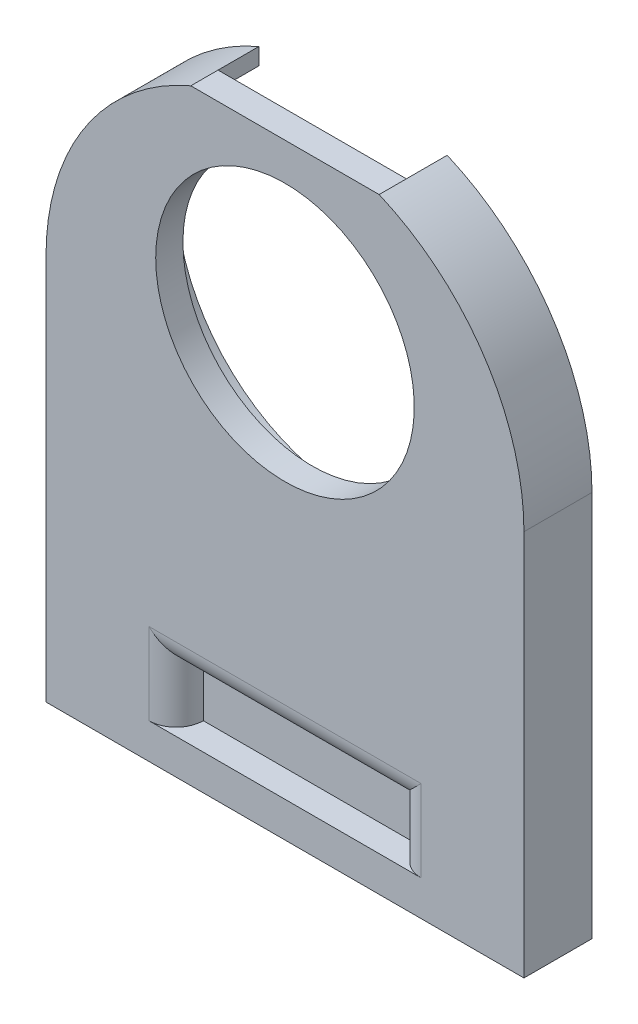
ISO-10303-21;
HEADER;
FILE_DESCRIPTION(('STEP AP214'),'2;1');
FILE_NAME('part.step','',(''),(''),'','','');
FILE_SCHEMA(('AUTOMOTIVE_DESIGN { 1 0 10303 214 1 1 1 1 }'));
ENDSEC;
DATA;
#1=APPLICATION_CONTEXT('core data for automotive mechanical design processes');
#2=APPLICATION_PROTOCOL_DEFINITION('international standard','automotive_design',2000,#1);
#3=PRODUCT_CONTEXT('',#1,'mechanical');
#4=PRODUCT('Part','Part','',(#3));
#5=PRODUCT_RELATED_PRODUCT_CATEGORY('part','',(#4));
#6=PRODUCT_DEFINITION_FORMATION('','',#4);
#7=PRODUCT_DEFINITION_CONTEXT('part definition',#1,'design');
#8=PRODUCT_DEFINITION('design','',#6,#7);
#9=PRODUCT_DEFINITION_SHAPE('','',#8);
#10=(LENGTH_UNIT() NAMED_UNIT(*) SI_UNIT(.MILLI.,.METRE.));
#11=(NAMED_UNIT(*) PLANE_ANGLE_UNIT() SI_UNIT($,.RADIAN.));
#12=(NAMED_UNIT(*) SI_UNIT($,.STERADIAN.) SOLID_ANGLE_UNIT());
#13=UNCERTAINTY_MEASURE_WITH_UNIT(LENGTH_MEASURE(1.E-05),#10,'distance_accuracy_value','');
#14=(GEOMETRIC_REPRESENTATION_CONTEXT(3) GLOBAL_UNCERTAINTY_ASSIGNED_CONTEXT((#13)) GLOBAL_UNIT_ASSIGNED_CONTEXT((#10,
#11,#12)) REPRESENTATION_CONTEXT('',''));
#15=CARTESIAN_POINT('',(0.,0.,0.));
#16=DIRECTION('',(0.,0.,1.));
#17=DIRECTION('',(1.,0.,0.));
#18=AXIS2_PLACEMENT_3D('',#15,#16,#17);
#19=CARTESIAN_POINT('',(8.78,8.5,1.5));
#20=DIRECTION('',(0.,0.,-1.));
#21=DIRECTION('',(-1.,0.,0.));
#22=AXIS2_PLACEMENT_3D('',#19,#20,#21);
#23=CYLINDRICAL_SURFACE('',#22,6.5);
#24=CARTESIAN_POINT('',(8.78,8.5,0.));
#25=DIRECTION('',(0.,0.,1.));
#26=DIRECTION('',(1.,0.,0.));
#27=AXIS2_PLACEMENT_3D('',#24,#25,#26);
#28=CIRCLE('',#27,6.5);
#29=CARTESIAN_POINT('',(5.32,14.0025812124856,0.));
#30=VERTEX_POINT('',#29);
#31=CARTESIAN_POINT('',(12.24,14.0025812124856,0.));
#32=VERTEX_POINT('',#31);
#33=EDGE_CURVE('E194',#30,#32,#28,.T.);
#34=ORIENTED_EDGE('',*,*,#33,.F.);
#35=DIRECTION('',(0.,0.,-1.));
#36=VECTOR('',#35,1.);
#37=CARTESIAN_POINT('',(5.32,14.0025812124856,1.5));
#38=LINE('',#37,#36);
#39=CARTESIAN_POINT('',(5.32,14.0025812124856,1.5));
#40=VERTEX_POINT('',#39);
#41=EDGE_CURVE('E233',#40,#30,#38,.T.);
#42=ORIENTED_EDGE('',*,*,#41,.F.);
#43=CARTESIAN_POINT('',(8.78,8.5,1.5));
#44=DIRECTION('',(0.,0.,1.));
#45=DIRECTION('',(1.,0.,0.));
#46=AXIS2_PLACEMENT_3D('',#43,#44,#45);
#47=CIRCLE('',#46,6.5);
#48=CARTESIAN_POINT('',(12.24,14.0025812124856,1.5));
#49=VERTEX_POINT('',#48);
#50=EDGE_CURVE('E195',#40,#49,#47,.T.);
#51=ORIENTED_EDGE('',*,*,#50,.T.);
#52=DIRECTION('',(0.,0.,-1.));
#53=VECTOR('',#52,1.);
#54=CARTESIAN_POINT('',(12.24,14.0025812124856,1.5));
#55=LINE('',#54,#53);
#56=EDGE_CURVE('E204',#49,#32,#55,.T.);
#57=ORIENTED_EDGE('',*,*,#56,.T.);
#58=EDGE_LOOP('',(#34,#42,#51,#57));
#59=FACE_BOUND('',#58,.T.);
#60=ADVANCED_FACE('F35',(#59),#23,.F.);
#61=CARTESIAN_POINT('',(5.32,0.,1.5));
#62=DIRECTION('',(-1.,0.,0.));
#63=DIRECTION('',(0.,0.,1.));
#64=AXIS2_PLACEMENT_3D('',#61,#62,#63);
#65=PLANE('',#64);
#66=DIRECTION('',(0.,1.,0.));
#67=VECTOR('',#66,1.);
#68=CARTESIAN_POINT('',(5.32,0.,0.));
#69=LINE('',#68,#67);
#70=CARTESIAN_POINT('',(5.32,14.6194981256581,0.));
#71=VERTEX_POINT('',#70);
#72=EDGE_CURVE('E207',#30,#71,#69,.T.);
#73=ORIENTED_EDGE('',*,*,#72,.T.);
#74=DIRECTION('',(0.,0.,-1.));
#75=VECTOR('',#74,1.);
#76=CARTESIAN_POINT('',(5.32,14.6194981256581,1.5));
#77=LINE('',#76,#75);
#78=CARTESIAN_POINT('',(5.32,14.6194981256581,1.5));
#79=VERTEX_POINT('',#78);
#80=EDGE_CURVE('E230',#79,#71,#77,.T.);
#81=ORIENTED_EDGE('',*,*,#80,.F.);
#82=DIRECTION('',(0.,1.,0.));
#83=VECTOR('',#82,1.);
#84=CARTESIAN_POINT('',(5.32,0.,1.5));
#85=LINE('',#84,#83);
#86=EDGE_CURVE('E198',#40,#79,#85,.T.);
#87=ORIENTED_EDGE('',*,*,#86,.F.);
#88=ORIENTED_EDGE('',*,*,#41,.T.);
#89=EDGE_LOOP('',(#73,#81,#87,#88));
#90=FACE_BOUND('',#89,.T.);
#91=ADVANCED_FACE('F256',(#90),#65,.F.);
#92=CARTESIAN_POINT('',(8.78,6.55,1.5));
#93=DIRECTION('',(0.,0.,-1.));
#94=DIRECTION('',(-1.,0.,0.));
#95=AXIS2_PLACEMENT_3D('',#92,#93,#94);
#96=CYLINDRICAL_SURFACE('',#95,8.78);
#97=CARTESIAN_POINT('',(8.78,6.55,0.));
#98=DIRECTION('',(0.,0.,1.));
#99=DIRECTION('',(1.,0.,0.));
#100=AXIS2_PLACEMENT_3D('',#97,#98,#99);
#101=CIRCLE('',#100,8.78);
#102=CARTESIAN_POINT('',(0.,6.55,0.));
#103=VERTEX_POINT('',#102);
#104=EDGE_CURVE('E209',#71,#103,#101,.T.);
#105=ORIENTED_EDGE('',*,*,#104,.T.);
#106=DIRECTION('',(0.,0.,-1.));
#107=VECTOR('',#106,1.);
#108=CARTESIAN_POINT('',(0.,6.55,1.5));
#109=LINE('',#108,#107);
#110=CARTESIAN_POINT('',(0.,6.55,2.5));
#111=VERTEX_POINT('',#110);
#112=EDGE_CURVE('E228',#111,#103,#109,.T.);
#113=ORIENTED_EDGE('',*,*,#112,.F.);
#114=CARTESIAN_POINT('',(8.78,6.55,2.5));
#115=DIRECTION('',(0.,0.,1.));
#116=DIRECTION('',(1.,0.,0.));
#117=AXIS2_PLACEMENT_3D('',#114,#115,#116);
#118=CIRCLE('',#117,8.78);
#119=CARTESIAN_POINT('',(5.32,14.6194981256581,2.5));
#120=VERTEX_POINT('',#119);
#121=EDGE_CURVE('E179',#120,#111,#118,.T.);
#122=ORIENTED_EDGE('',*,*,#121,.F.);
#123=DIRECTION('',(0.,0.,-1.));
#124=VECTOR('',#123,1.);
#125=CARTESIAN_POINT('',(5.32,14.6194981256581,2.5));
#126=LINE('',#125,#124);
#127=EDGE_CURVE('E187',#120,#79,#126,.T.);
#128=ORIENTED_EDGE('',*,*,#127,.T.);
#129=ORIENTED_EDGE('',*,*,#80,.T.);
#130=EDGE_LOOP('',(#105,#113,#122,#128,#129));
#131=FACE_BOUND('',#130,.T.);
#132=ADVANCED_FACE('F262',(#131),#96,.T.);
#133=CARTESIAN_POINT('',(0.,0.,1.5));
#134=DIRECTION('',(-1.,0.,0.));
#135=DIRECTION('',(0.,0.,1.));
#136=AXIS2_PLACEMENT_3D('',#133,#134,#135);
#137=PLANE('',#136);
#138=DIRECTION('',(0.,1.,0.));
#139=VECTOR('',#138,1.);
#140=CARTESIAN_POINT('',(0.,0.,0.));
#141=LINE('',#140,#139);
#142=CARTESIAN_POINT('',(0.,-7.65,0.));
#143=VERTEX_POINT('',#142);
#144=EDGE_CURVE('E212',#143,#103,#141,.T.);
#145=ORIENTED_EDGE('',*,*,#144,.F.);
#146=DIRECTION('',(0.,0.,-1.));
#147=VECTOR('',#146,1.);
#148=CARTESIAN_POINT('',(0.,-7.65,2.5));
#149=LINE('',#148,#147);
#150=CARTESIAN_POINT('',(0.,-7.65,2.5));
#151=VERTEX_POINT('',#150);
#152=EDGE_CURVE('E158',#151,#143,#149,.T.);
#153=ORIENTED_EDGE('',*,*,#152,.F.);
#154=DIRECTION('',(0.,-1.,0.));
#155=VECTOR('',#154,1.);
#156=CARTESIAN_POINT('',(0.,0.,2.5));
#157=LINE('',#156,#155);
#158=EDGE_CURVE('E182',#111,#151,#157,.T.);
#159=ORIENTED_EDGE('',*,*,#158,.F.);
#160=ORIENTED_EDGE('',*,*,#112,.T.);
#161=EDGE_LOOP('',(#145,#153,#159,#160));
#162=FACE_BOUND('',#161,.T.);
#163=ADVANCED_FACE('F324',(#162),#137,.T.);
#164=CARTESIAN_POINT('',(17.56,0.,1.5));
#165=DIRECTION('',(-1.,0.,0.));
#166=DIRECTION('',(0.,0.,1.));
#167=AXIS2_PLACEMENT_3D('',#164,#165,#166);
#168=PLANE('',#167);
#169=DIRECTION('',(0.,1.,0.));
#170=VECTOR('',#169,1.);
#171=CARTESIAN_POINT('',(17.56,0.,0.));
#172=LINE('',#171,#170);
#173=CARTESIAN_POINT('',(17.56,-7.65,0.));
#174=VERTEX_POINT('',#173);
#175=CARTESIAN_POINT('',(17.56,6.55,0.));
#176=VERTEX_POINT('',#175);
#177=EDGE_CURVE('E215',#174,#176,#172,.T.);
#178=ORIENTED_EDGE('',*,*,#177,.T.);
#179=DIRECTION('',(0.,0.,-1.));
#180=VECTOR('',#179,1.);
#181=CARTESIAN_POINT('',(17.56,6.55,1.5));
#182=LINE('',#181,#180);
#183=CARTESIAN_POINT('',(17.56,6.55,2.5));
#184=VERTEX_POINT('',#183);
#185=EDGE_CURVE('E225',#184,#176,#182,.T.);
#186=ORIENTED_EDGE('',*,*,#185,.F.);
#187=DIRECTION('',(0.,1.,0.));
#188=VECTOR('',#187,1.);
#189=CARTESIAN_POINT('',(17.56,0.,2.5));
#190=LINE('',#189,#188);
#191=CARTESIAN_POINT('',(17.56,-7.65,2.5));
#192=VERTEX_POINT('',#191);
#193=EDGE_CURVE('E184',#192,#184,#190,.T.);
#194=ORIENTED_EDGE('',*,*,#193,.F.);
#195=DIRECTION('',(0.,0.,1.));
#196=VECTOR('',#195,1.);
#197=CARTESIAN_POINT('',(17.56,-7.65,0.));
#198=LINE('',#197,#196);
#199=EDGE_CURVE('E164',#174,#192,#198,.T.);
#200=ORIENTED_EDGE('',*,*,#199,.F.);
#201=EDGE_LOOP('',(#178,#186,#194,#200));
#202=FACE_BOUND('',#201,.T.);
#203=ADVANCED_FACE('F320',(#202),#168,.F.);
#204=CARTESIAN_POINT('',(8.78,6.55,1.5));
#205=DIRECTION('',(0.,0.,-1.));
#206=DIRECTION('',(-1.,0.,0.));
#207=AXIS2_PLACEMENT_3D('',#204,#205,#206);
#208=CYLINDRICAL_SURFACE('',#207,8.78);
#209=CARTESIAN_POINT('',(8.78,6.55,0.));
#210=DIRECTION('',(0.,0.,1.));
#211=DIRECTION('',(1.,0.,0.));
#212=AXIS2_PLACEMENT_3D('',#209,#210,#211);
#213=CIRCLE('',#212,8.78);
#214=CARTESIAN_POINT('',(12.24,14.6194981256581,0.));
#215=VERTEX_POINT('',#214);
#216=EDGE_CURVE('E217',#176,#215,#213,.T.);
#217=ORIENTED_EDGE('',*,*,#216,.T.);
#218=DIRECTION('',(0.,0.,-1.));
#219=VECTOR('',#218,1.);
#220=CARTESIAN_POINT('',(12.24,14.6194981256581,1.5));
#221=LINE('',#220,#219);
#222=CARTESIAN_POINT('',(12.24,14.6194981256581,1.5));
#223=VERTEX_POINT('',#222);
#224=EDGE_CURVE('E223',#223,#215,#221,.T.);
#225=ORIENTED_EDGE('',*,*,#224,.F.);
#226=DIRECTION('',(0.,0.,-1.));
#227=VECTOR('',#226,1.);
#228=CARTESIAN_POINT('',(12.24,14.6194981256581,2.5));
#229=LINE('',#228,#227);
#230=CARTESIAN_POINT('',(12.24,14.6194981256581,2.5));
#231=VERTEX_POINT('',#230);
#232=EDGE_CURVE('E191',#231,#223,#229,.T.);
#233=ORIENTED_EDGE('',*,*,#232,.F.);
#234=CARTESIAN_POINT('',(8.78,6.55,2.5));
#235=DIRECTION('',(0.,0.,1.));
#236=DIRECTION('',(1.,0.,0.));
#237=AXIS2_PLACEMENT_3D('',#234,#235,#236);
#238=CIRCLE('',#237,8.78);
#239=EDGE_CURVE('E174',#184,#231,#238,.T.);
#240=ORIENTED_EDGE('',*,*,#239,.F.);
#241=ORIENTED_EDGE('',*,*,#185,.T.);
#242=EDGE_LOOP('',(#217,#225,#233,#240,#241));
#243=FACE_BOUND('',#242,.T.);
#244=ADVANCED_FACE('F323',(#243),#208,.T.);
#245=CARTESIAN_POINT('',(12.24,0.,1.5));
#246=DIRECTION('',(-1.,0.,0.));
#247=DIRECTION('',(0.,0.,1.));
#248=AXIS2_PLACEMENT_3D('',#245,#246,#247);
#249=PLANE('',#248);
#250=DIRECTION('',(0.,1.,0.));
#251=VECTOR('',#250,1.);
#252=CARTESIAN_POINT('',(12.24,0.,0.));
#253=LINE('',#252,#251);
#254=EDGE_CURVE('E199',#32,#215,#253,.T.);
#255=ORIENTED_EDGE('',*,*,#254,.F.);
#256=ORIENTED_EDGE('',*,*,#56,.F.);
#257=DIRECTION('',(0.,1.,0.));
#258=VECTOR('',#257,1.);
#259=CARTESIAN_POINT('',(12.24,0.,1.5));
#260=LINE('',#259,#258);
#261=EDGE_CURVE('E201',#49,#223,#260,.T.);
#262=ORIENTED_EDGE('',*,*,#261,.T.);
#263=ORIENTED_EDGE('',*,*,#224,.T.);
#264=EDGE_LOOP('',(#255,#256,#262,#263));
#265=FACE_BOUND('',#264,.T.);
#266=ADVANCED_FACE('F311',(#265),#249,.T.);
#267=CARTESIAN_POINT('',(0.,0.,0.));
#268=DIRECTION('',(0.,0.,1.));
#269=DIRECTION('',(1.,0.,0.));
#270=AXIS2_PLACEMENT_3D('',#267,#268,#269);
#271=PLANE('',#270);
#272=ORIENTED_EDGE('',*,*,#33,.T.);
#273=ORIENTED_EDGE('',*,*,#254,.T.);
#274=ORIENTED_EDGE('',*,*,#216,.F.);
#275=ORIENTED_EDGE('',*,*,#177,.F.);
#276=DIRECTION('',(1.,0.,0.));
#277=VECTOR('',#276,1.);
#278=CARTESIAN_POINT('',(0.,-7.65,0.));
#279=LINE('',#278,#277);
#280=EDGE_CURVE('E161',#143,#174,#279,.T.);
#281=ORIENTED_EDGE('',*,*,#280,.F.);
#282=ORIENTED_EDGE('',*,*,#144,.T.);
#283=ORIENTED_EDGE('',*,*,#104,.F.);
#284=ORIENTED_EDGE('',*,*,#72,.F.);
#285=EDGE_LOOP('',(#272,#273,#274,#275,#281,#282,#283,#284));
#286=FACE_BOUND('',#285,.T.);
#287=ADVANCED_FACE('F307',(#286),#271,.F.);
#288=CARTESIAN_POINT('',(0.,0.,1.5));
#289=DIRECTION('',(0.,0.,1.));
#290=DIRECTION('',(1.,0.,0.));
#291=AXIS2_PLACEMENT_3D('',#288,#289,#290);
#292=PLANE('',#291);
#293=CARTESIAN_POINT('',(8.78,8.5,1.5));
#294=DIRECTION('',(0.,0.,-1.));
#295=DIRECTION('',(-1.,0.,0.));
#296=AXIS2_PLACEMENT_3D('',#293,#294,#295);
#297=CIRCLE('',#296,4.75);
#298=CARTESIAN_POINT('',(4.03,8.5,1.5));
#299=VERTEX_POINT('',#298);
#300=EDGE_CURVE('E167',#299,#299,#297,.T.);
#301=ORIENTED_EDGE('',*,*,#300,.F.);
#302=EDGE_LOOP('',(#301));
#303=FACE_BOUND('',#302,.T.);
#304=ORIENTED_EDGE('',*,*,#50,.F.);
#305=ORIENTED_EDGE('',*,*,#86,.T.);
#306=DIRECTION('',(1.,0.,0.));
#307=VECTOR('',#306,1.);
#308=CARTESIAN_POINT('',(0.,14.6194981256581,1.5));
#309=LINE('',#308,#307);
#310=EDGE_CURVE('E171',#79,#223,#309,.T.);
#311=ORIENTED_EDGE('',*,*,#310,.T.);
#312=ORIENTED_EDGE('',*,*,#261,.F.);
#313=EDGE_LOOP('',(#304,#305,#311,#312));
#314=FACE_BOUND('',#313,.T.);
#315=ADVANCED_FACE('F310',(#303,#314),#292,.F.);
#316=CARTESIAN_POINT('',(0.,14.6194981256581,2.5));
#317=DIRECTION('',(0.,1.,0.));
#318=DIRECTION('',(0.,0.,1.));
#319=AXIS2_PLACEMENT_3D('',#316,#317,#318);
#320=PLANE('',#319);
#321=ORIENTED_EDGE('',*,*,#310,.F.);
#322=ORIENTED_EDGE('',*,*,#127,.F.);
#323=DIRECTION('',(1.,0.,0.));
#324=VECTOR('',#323,1.);
#325=CARTESIAN_POINT('',(0.,14.6194981256581,2.5));
#326=LINE('',#325,#324);
#327=EDGE_CURVE('E176',#120,#231,#326,.T.);
#328=ORIENTED_EDGE('',*,*,#327,.T.);
#329=ORIENTED_EDGE('',*,*,#232,.T.);
#330=EDGE_LOOP('',(#321,#322,#328,#329));
#331=FACE_BOUND('',#330,.T.);
#332=ADVANCED_FACE('F294',(#331),#320,.T.);
#333=CARTESIAN_POINT('',(0.,0.,2.5));
#334=DIRECTION('',(0.,0.,1.));
#335=DIRECTION('',(1.,0.,0.));
#336=AXIS2_PLACEMENT_3D('',#333,#334,#335);
#337=PLANE('',#336);
#338=DIRECTION('',(0.,1.,0.));
#339=VECTOR('',#338,1.);
#340=CARTESIAN_POINT('',(13.78,-6.35316683145248,2.5));
#341=LINE('',#340,#339);
#342=CARTESIAN_POINT('',(13.78,-3.35316683145248,2.5));
#343=VERTEX_POINT('',#342);
#344=CARTESIAN_POINT('',(13.78,-6.35316683145248,2.5));
#345=VERTEX_POINT('',#344);
#346=EDGE_CURVE('E142',#343,#345,#341,.F.);
#347=ORIENTED_EDGE('',*,*,#346,.T.);
#348=DIRECTION('',(1.,0.,0.));
#349=VECTOR('',#348,1.);
#350=CARTESIAN_POINT('',(12.78,-6.35316683145248,2.5));
#351=LINE('',#350,#349);
#352=CARTESIAN_POINT('',(3.78,-6.35316683145248,2.5));
#353=VERTEX_POINT('',#352);
#354=EDGE_CURVE('E52',#353,#345,#351,.T.);
#355=ORIENTED_EDGE('',*,*,#354,.F.);
#356=DIRECTION('',(0.,-1.,0.));
#357=VECTOR('',#356,1.);
#358=CARTESIAN_POINT('',(3.78,-4.35316683145248,2.5));
#359=LINE('',#358,#357);
#360=CARTESIAN_POINT('',(3.78,-3.35316683145248,2.5));
#361=VERTEX_POINT('',#360);
#362=EDGE_CURVE('E238',#353,#361,#359,.F.);
#363=ORIENTED_EDGE('',*,*,#362,.T.);
#364=DIRECTION('',(-1.,0.,0.));
#365=VECTOR('',#364,1.);
#366=CARTESIAN_POINT('',(12.78,-3.35316683145248,2.5));
#367=LINE('',#366,#365);
#368=EDGE_CURVE('E235',#361,#343,#367,.F.);
#369=ORIENTED_EDGE('',*,*,#368,.T.);
#370=EDGE_LOOP('',(#347,#355,#363,#369));
#371=FACE_BOUND('',#370,.T.);
#372=CARTESIAN_POINT('',(8.78,8.5,2.5));
#373=DIRECTION('',(0.,0.,-1.));
#374=DIRECTION('',(-1.,0.,0.));
#375=AXIS2_PLACEMENT_3D('',#372,#373,#374);
#376=CIRCLE('',#375,4.75);
#377=CARTESIAN_POINT('',(4.03,8.5,2.5));
#378=VERTEX_POINT('',#377);
#379=EDGE_CURVE('E168',#378,#378,#376,.T.);
#380=ORIENTED_EDGE('',*,*,#379,.T.);
#381=EDGE_LOOP('',(#380));
#382=FACE_BOUND('',#381,.T.);
#383=ORIENTED_EDGE('',*,*,#239,.T.);
#384=ORIENTED_EDGE('',*,*,#327,.F.);
#385=ORIENTED_EDGE('',*,*,#121,.T.);
#386=ORIENTED_EDGE('',*,*,#158,.T.);
#387=DIRECTION('',(-1.,0.,0.));
#388=VECTOR('',#387,1.);
#389=CARTESIAN_POINT('',(17.56,-7.65,2.5));
#390=LINE('',#389,#388);
#391=EDGE_CURVE('E154',#192,#151,#390,.T.);
#392=ORIENTED_EDGE('',*,*,#391,.F.);
#393=ORIENTED_EDGE('',*,*,#193,.T.);
#394=EDGE_LOOP('',(#383,#384,#385,#386,#392,#393));
#395=FACE_BOUND('',#394,.T.);
#396=ADVANCED_FACE('F289',(#371,#382,#395),#337,.T.);
#397=CARTESIAN_POINT('',(8.78,8.5,2.5));
#398=DIRECTION('',(0.,0.,-1.));
#399=DIRECTION('',(-1.,0.,0.));
#400=AXIS2_PLACEMENT_3D('',#397,#398,#399);
#401=CYLINDRICAL_SURFACE('',#400,4.75);
#402=ORIENTED_EDGE('',*,*,#379,.F.);
#403=EDGE_LOOP('',(#402));
#404=FACE_BOUND('',#403,.T.);
#405=ORIENTED_EDGE('',*,*,#300,.T.);
#406=EDGE_LOOP('',(#405));
#407=FACE_BOUND('',#406,.T.);
#408=ADVANCED_FACE('F252',(#404,#407),#401,.F.);
#409=CARTESIAN_POINT('',(0.,-7.65,0.));
#410=DIRECTION('',(0.,-1.,0.));
#411=DIRECTION('',(0.,0.,-1.));
#412=AXIS2_PLACEMENT_3D('',#409,#410,#411);
#413=PLANE('',#412);
#414=ORIENTED_EDGE('',*,*,#391,.T.);
#415=ORIENTED_EDGE('',*,*,#152,.T.);
#416=ORIENTED_EDGE('',*,*,#280,.T.);
#417=ORIENTED_EDGE('',*,*,#199,.T.);
#418=EDGE_LOOP('',(#414,#415,#416,#417));
#419=FACE_BOUND('',#418,.T.);
#420=ADVANCED_FACE('F245',(#419),#413,.T.);
#421=CARTESIAN_POINT('',(12.78,-6.35316683145248,1.5));
#422=DIRECTION('',(0.,-1.,0.));
#423=DIRECTION('',(1.,0.,0.));
#424=AXIS2_PLACEMENT_3D('',#421,#422,#423);
#425=PLANE('',#424);
#426=ORIENTED_EDGE('',*,*,#354,.T.);
#427=CARTESIAN_POINT('',(13.78,-6.35316683145248,1.5));
#428=DIRECTION('',(0.,-1.,0.));
#429=DIRECTION('',(1.,0.,0.));
#430=AXIS2_PLACEMENT_3D('',#427,#428,#429);
#431=CIRCLE('',#430,1.);
#432=CARTESIAN_POINT('',(12.78,-6.35316683145248,1.5));
#433=VERTEX_POINT('',#432);
#434=EDGE_CURVE('E11',#345,#433,#431,.T.);
#435=ORIENTED_EDGE('',*,*,#434,.T.);
#436=DIRECTION('',(1.,0.,0.));
#437=VECTOR('',#436,1.);
#438=CARTESIAN_POINT('',(12.78,-6.35316683145248,1.5));
#439=LINE('',#438,#437);
#440=CARTESIAN_POINT('',(4.78,-6.35316683145248,1.5));
#441=VERTEX_POINT('',#440);
#442=EDGE_CURVE('E136',#441,#433,#439,.T.);
#443=ORIENTED_EDGE('',*,*,#442,.F.);
#444=CARTESIAN_POINT('',(3.78,-6.35316683145248,1.5));
#445=DIRECTION('',(0.,-1.,0.));
#446=DIRECTION('',(1.,0.,0.));
#447=AXIS2_PLACEMENT_3D('',#444,#445,#446);
#448=CIRCLE('',#447,1.);
#449=EDGE_CURVE('E44',#441,#353,#448,.T.);
#450=ORIENTED_EDGE('',*,*,#449,.T.);
#451=EDGE_LOOP('',(#426,#435,#443,#450));
#452=FACE_BOUND('',#451,.T.);
#453=ADVANCED_FACE('F243',(#452),#425,.F.);
#454=CARTESIAN_POINT('',(0.,0.,1.5));
#455=DIRECTION('',(0.,0.,1.));
#456=DIRECTION('',(1.,0.,0.));
#457=AXIS2_PLACEMENT_3D('',#454,#455,#456);
#458=PLANE('',#457);
#459=DIRECTION('',(0.,1.,0.));
#460=VECTOR('',#459,1.);
#461=CARTESIAN_POINT('',(12.78,-6.35316683145248,1.5));
#462=LINE('',#461,#460);
#463=CARTESIAN_POINT('',(12.78,-4.35316683145248,1.5));
#464=VERTEX_POINT('',#463);
#465=EDGE_CURVE('E128',#433,#464,#462,.T.);
#466=ORIENTED_EDGE('',*,*,#465,.T.);
#467=DIRECTION('',(-1.,0.,0.));
#468=VECTOR('',#467,1.);
#469=CARTESIAN_POINT('',(12.78,-4.35316683145248,1.5));
#470=LINE('',#469,#468);
#471=CARTESIAN_POINT('',(4.78,-4.35316683145248,1.5));
#472=VERTEX_POINT('',#471);
#473=EDGE_CURVE('E133',#464,#472,#470,.T.);
#474=ORIENTED_EDGE('',*,*,#473,.T.);
#475=DIRECTION('',(0.,-1.,0.));
#476=VECTOR('',#475,1.);
#477=CARTESIAN_POINT('',(4.78,-6.35316683145248,1.5));
#478=LINE('',#477,#476);
#479=EDGE_CURVE('E149',#472,#441,#478,.T.);
#480=ORIENTED_EDGE('',*,*,#479,.T.);
#481=ORIENTED_EDGE('',*,*,#442,.T.);
#482=EDGE_LOOP('',(#466,#474,#480,#481));
#483=FACE_BOUND('',#482,.T.);
#484=ADVANCED_FACE('F130',(#483),#458,.T.);
#485=CARTESIAN_POINT('',(13.78,-6.35316683145248,1.5));
#486=DIRECTION('',(0.,-1.,0.));
#487=DIRECTION('',(0.,0.,-1.));
#488=AXIS2_PLACEMENT_3D('',#485,#486,#487);
#489=CYLINDRICAL_SURFACE('',#488,1.);
#490=ORIENTED_EDGE('',*,*,#434,.F.);
#491=ORIENTED_EDGE('',*,*,#346,.F.);
#492=CARTESIAN_POINT('',(13.78,-3.35316683145248,1.5));
#493=DIRECTION('',(0.707106781186547,-0.707106781186547,0.));
#494=DIRECTION('',(-0.707106781186547,-0.707106781186547,0.));
#495=AXIS2_PLACEMENT_3D('',#492,#493,#494);
#496=ELLIPSE('',#495,1.41421356237309,1.);
#497=EDGE_CURVE('E39',#464,#343,#496,.F.);
#498=ORIENTED_EDGE('',*,*,#497,.F.);
#499=ORIENTED_EDGE('',*,*,#465,.F.);
#500=EDGE_LOOP('',(#490,#491,#498,#499));
#501=FACE_BOUND('',#500,.T.);
#502=ADVANCED_FACE('F37',(#501),#489,.T.);
#503=CARTESIAN_POINT('',(12.78,-3.35316683145248,1.5));
#504=DIRECTION('',(1.,0.,0.));
#505=DIRECTION('',(0.,0.,-1.));
#506=AXIS2_PLACEMENT_3D('',#503,#504,#505);
#507=CYLINDRICAL_SURFACE('',#506,1.);
#508=ORIENTED_EDGE('',*,*,#497,.T.);
#509=ORIENTED_EDGE('',*,*,#368,.F.);
#510=CARTESIAN_POINT('',(3.78,-3.35316683145248,1.5));
#511=DIRECTION('',(0.707106781186547,0.707106781186547,0.));
#512=DIRECTION('',(-0.707106781186547,0.707106781186547,0.));
#513=AXIS2_PLACEMENT_3D('',#510,#511,#512);
#514=ELLIPSE('',#513,1.41421356237309,1.);
#515=EDGE_CURVE('E145',#472,#361,#514,.F.);
#516=ORIENTED_EDGE('',*,*,#515,.F.);
#517=ORIENTED_EDGE('',*,*,#473,.F.);
#518=EDGE_LOOP('',(#508,#509,#516,#517));
#519=FACE_BOUND('',#518,.T.);
#520=ADVANCED_FACE('F146',(#519),#507,.T.);
#521=CARTESIAN_POINT('',(3.78,-6.35316683145248,1.5));
#522=DIRECTION('',(0.,1.,0.));
#523=DIRECTION('',(0.,0.,1.));
#524=AXIS2_PLACEMENT_3D('',#521,#522,#523);
#525=CYLINDRICAL_SURFACE('',#524,1.);
#526=ORIENTED_EDGE('',*,*,#515,.T.);
#527=ORIENTED_EDGE('',*,*,#362,.F.);
#528=ORIENTED_EDGE('',*,*,#449,.F.);
#529=ORIENTED_EDGE('',*,*,#479,.F.);
#530=EDGE_LOOP('',(#526,#527,#528,#529));
#531=FACE_BOUND('',#530,.T.);
#532=ADVANCED_FACE('F242',(#531),#525,.T.);
#533=CLOSED_SHELL('',(#60,#91,#132,#163,#203,#244,#266,#287,#315,#332,#396,#408,#420,#453,#484,
#502,#520,#532));
#534=MANIFOLD_SOLID_BREP('B2',#533);
#535=ADVANCED_BREP_SHAPE_REPRESENTATION('',(#18,#534),#14);
#536=SHAPE_DEFINITION_REPRESENTATION(#9,#535);
ENDSEC;
END-ISO-10303-21;
